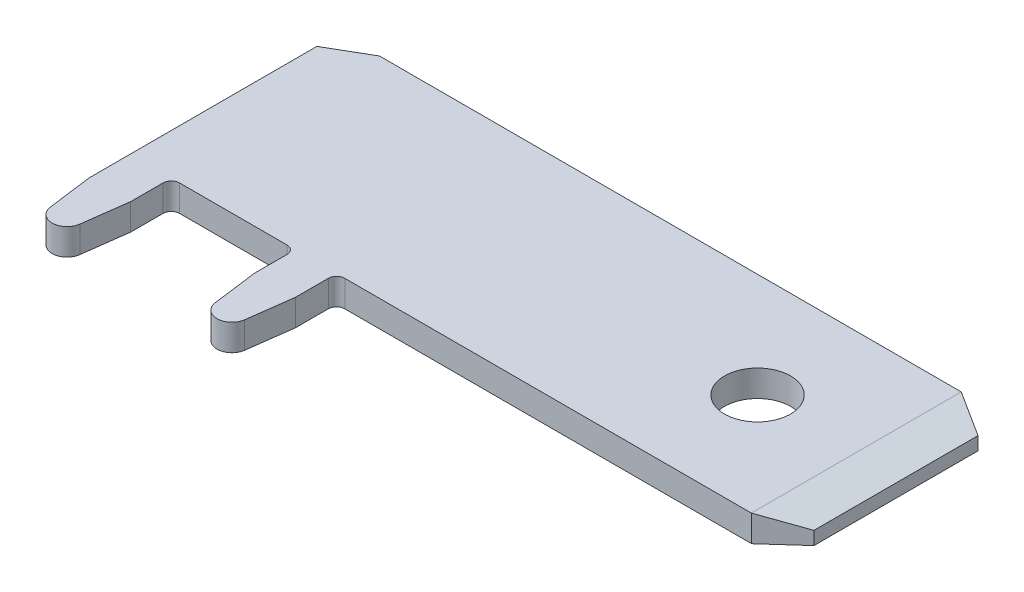
ISO-10303-21;
HEADER;
FILE_DESCRIPTION(('STEP AP214'),'2;1');
FILE_NAME('part.step','',(''),(''),'','','');
FILE_SCHEMA(('AUTOMOTIVE_DESIGN { 1 0 10303 214 1 1 1 1 }'));
ENDSEC;
DATA;
#1=APPLICATION_CONTEXT('core data for automotive mechanical design processes');
#2=APPLICATION_PROTOCOL_DEFINITION('international standard','automotive_design',2000,#1);
#3=PRODUCT_CONTEXT('',#1,'mechanical');
#4=PRODUCT('Part','Part','',(#3));
#5=PRODUCT_RELATED_PRODUCT_CATEGORY('part','',(#4));
#6=PRODUCT_DEFINITION_FORMATION('','',#4);
#7=PRODUCT_DEFINITION_CONTEXT('part definition',#1,'design');
#8=PRODUCT_DEFINITION('design','',#6,#7);
#9=PRODUCT_DEFINITION_SHAPE('','',#8);
#10=(LENGTH_UNIT() NAMED_UNIT(*) SI_UNIT(.MILLI.,.METRE.));
#11=(NAMED_UNIT(*) PLANE_ANGLE_UNIT() SI_UNIT($,.RADIAN.));
#12=(NAMED_UNIT(*) SI_UNIT($,.STERADIAN.) SOLID_ANGLE_UNIT());
#13=UNCERTAINTY_MEASURE_WITH_UNIT(LENGTH_MEASURE(1.E-05),#10,'distance_accuracy_value','');
#14=(GEOMETRIC_REPRESENTATION_CONTEXT(3) GLOBAL_UNCERTAINTY_ASSIGNED_CONTEXT((#13)) GLOBAL_UNIT_ASSIGNED_CONTEXT((#10,
#11,#12)) REPRESENTATION_CONTEXT('',''));
#15=CARTESIAN_POINT('',(0.,0.,0.));
#16=DIRECTION('',(0.,0.,1.));
#17=DIRECTION('',(1.,0.,0.));
#18=AXIS2_PLACEMENT_3D('',#15,#16,#17);
#19=CARTESIAN_POINT('',(19.99062151867,0.2,-6.35));
#20=DIRECTION('',(-0.164398987305406,-0.986393923832136,0.));
#21=DIRECTION('',(0.986393923832136,-0.164398987305406,0.));
#22=AXIS2_PLACEMENT_3D('',#19,#20,#21);
#23=PLANE('',#22);
#24=DIRECTION('',(-0.857142857142847,0.142857142857145,0.49487165930541));
#25=VECTOR('',#24,1.);
#26=CARTESIAN_POINT('',(19.99062151867,0.2,-0.692820323027562));
#27=LINE('',#26,#25);
#28=CARTESIAN_POINT('',(19.99062151867,0.2,-0.692820323027541));
#29=VERTEX_POINT('',#28);
#30=CARTESIAN_POINT('',(18.79062151867,0.4,0.));
#31=VERTEX_POINT('',#30);
#32=EDGE_CURVE('E202',#29,#31,#27,.T.);
#33=ORIENTED_EDGE('',*,*,#32,.F.);
#34=DIRECTION('',(0.,0.,-1.));
#35=VECTOR('',#34,1.);
#36=CARTESIAN_POINT('',(19.99062151867,0.2,-0.6928203230275));
#37=LINE('',#36,#35);
#38=CARTESIAN_POINT('',(19.99062151867,0.2,-5.657179676972));
#39=VERTEX_POINT('',#38);
#40=EDGE_CURVE('E274',#39,#29,#37,.F.);
#41=ORIENTED_EDGE('',*,*,#40,.F.);
#42=DIRECTION('',(0.85714285714285,-0.14285714285712,0.494871659305411));
#43=VECTOR('',#42,1.);
#44=CARTESIAN_POINT('',(18.7906215186698,0.4,-6.34999999999969));
#45=LINE('',#44,#43);
#46=CARTESIAN_POINT('',(18.79062151867,0.4,-6.34999999999992));
#47=VERTEX_POINT('',#46);
#48=EDGE_CURVE('E267',#47,#39,#45,.T.);
#49=ORIENTED_EDGE('',*,*,#48,.F.);
#50=DIRECTION('',(0.,0.,1.));
#51=VECTOR('',#50,1.);
#52=CARTESIAN_POINT('',(18.79062151867,0.4,0.));
#53=LINE('',#52,#51);
#54=EDGE_CURVE('E172',#31,#47,#53,.F.);
#55=ORIENTED_EDGE('',*,*,#54,.F.);
#56=EDGE_LOOP('',(#33,#41,#49,#55));
#57=FACE_BOUND('',#56,.T.);
#58=ADVANCED_FACE('F16',(#57),#23,.F.);
#59=CARTESIAN_POINT('',(19.99062151867,-0.4,-0.6928203230275));
#60=DIRECTION('',(1.,0.,0.));
#61=DIRECTION('',(0.,0.,-1.));
#62=AXIS2_PLACEMENT_3D('',#59,#60,#61);
#63=PLANE('',#62);
#64=DIRECTION('',(0.,1.,0.));
#65=VECTOR('',#64,1.);
#66=CARTESIAN_POINT('',(19.99062151867,-0.4,-0.692820323027562));
#67=LINE('',#66,#65);
#68=CARTESIAN_POINT('',(19.99062151867,-0.200000000000342,-0.69282032302753));
#69=VERTEX_POINT('',#68);
#70=EDGE_CURVE('E206',#69,#29,#67,.T.);
#71=ORIENTED_EDGE('',*,*,#70,.F.);
#72=DIRECTION('',(0.,0.,1.));
#73=VECTOR('',#72,1.);
#74=CARTESIAN_POINT('',(19.9906215186701,-0.200000000000547,-6.35));
#75=LINE('',#74,#73);
#76=CARTESIAN_POINT('',(19.99062151867,-0.200000000000137,-5.657179676972));
#77=VERTEX_POINT('',#76);
#78=EDGE_CURVE('E279',#69,#77,#75,.F.);
#79=ORIENTED_EDGE('',*,*,#78,.T.);
#80=DIRECTION('',(0.,1.,0.));
#81=VECTOR('',#80,1.);
#82=CARTESIAN_POINT('',(19.99062151867,-0.4,-5.657179676972));
#83=LINE('',#82,#81);
#84=EDGE_CURVE('E269',#39,#77,#83,.F.);
#85=ORIENTED_EDGE('',*,*,#84,.F.);
#86=ORIENTED_EDGE('',*,*,#40,.T.);
#87=EDGE_LOOP('',(#71,#79,#85,#86));
#88=FACE_BOUND('',#87,.T.);
#89=ADVANCED_FACE('F392',(#88),#63,.T.);
#90=CARTESIAN_POINT('',(19.99062151867,-0.4,-5.657179676972));
#91=DIRECTION('',(0.500000000000017,0.,-0.866025403784429));
#92=DIRECTION('',(-0.866025403784429,0.,-0.500000000000017));
#93=AXIS2_PLACEMENT_3D('',#90,#91,#92);
#94=PLANE('',#93);
#95=ORIENTED_EDGE('',*,*,#84,.T.);
#96=DIRECTION('',(-0.856848278928121,-0.145194246428069,-0.49470158449524));
#97=VECTOR('',#96,1.);
#98=CARTESIAN_POINT('',(19.9906215186701,-0.200000000000547,-5.657179676972));
#99=LINE('',#98,#97);
#100=CARTESIAN_POINT('',(18.8103429607996,-0.4,-6.33861382007789));
#101=VERTEX_POINT('',#100);
#102=EDGE_CURVE('E198',#77,#101,#99,.T.);
#103=ORIENTED_EDGE('',*,*,#102,.T.);
#104=DIRECTION('',(-0.866025403784429,0.,-0.500000000000017));
#105=VECTOR('',#104,1.);
#106=CARTESIAN_POINT('',(19.99062151867,-0.4,-5.657179676972));
#107=LINE('',#106,#105);
#108=CARTESIAN_POINT('',(18.7906215186699,-0.4,-6.34999999999989));
#109=VERTEX_POINT('',#108);
#110=EDGE_CURVE('E270',#101,#109,#107,.T.);
#111=ORIENTED_EDGE('',*,*,#110,.T.);
#112=DIRECTION('',(0.,1.,0.));
#113=VECTOR('',#112,1.);
#114=CARTESIAN_POINT('',(18.79062151867,-0.4,-6.35));
#115=LINE('',#114,#113);
#116=EDGE_CURVE('E177',#47,#109,#115,.F.);
#117=ORIENTED_EDGE('',*,*,#116,.F.);
#118=ORIENTED_EDGE('',*,*,#48,.T.);
#119=EDGE_LOOP('',(#95,#103,#111,#117,#118));
#120=FACE_BOUND('',#119,.T.);
#121=ADVANCED_FACE('F385',(#120),#94,.T.);
#122=CARTESIAN_POINT('',(18.79062151867,-0.4,0.));
#123=DIRECTION('',(0.500000000000017,0.,0.866025403784429));
#124=DIRECTION('',(0.866025403784429,0.,-0.500000000000017));
#125=AXIS2_PLACEMENT_3D('',#122,#123,#124);
#126=PLANE('',#125);
#127=DIRECTION('',(0.866025403784429,0.,-0.500000000000017));
#128=VECTOR('',#127,1.);
#129=CARTESIAN_POINT('',(18.79062151867,-0.4,0.));
#130=LINE('',#129,#128);
#131=CARTESIAN_POINT('',(18.79062151867,-0.4,0.));
#132=VERTEX_POINT('',#131);
#133=CARTESIAN_POINT('',(18.8103429607992,-0.4,-0.0113861799221007));
#134=VERTEX_POINT('',#133);
#135=EDGE_CURVE('E34',#132,#134,#130,.T.);
#136=ORIENTED_EDGE('',*,*,#135,.T.);
#137=DIRECTION('',(0.856848278928186,0.14519424642808,-0.494701584495125));
#138=VECTOR('',#137,1.);
#139=CARTESIAN_POINT('',(18.8103429608,-0.4,-0.0113861799207098));
#140=LINE('',#139,#138);
#141=EDGE_CURVE('E216',#134,#69,#140,.T.);
#142=ORIENTED_EDGE('',*,*,#141,.T.);
#143=ORIENTED_EDGE('',*,*,#70,.T.);
#144=ORIENTED_EDGE('',*,*,#32,.T.);
#145=DIRECTION('',(0.,1.,0.));
#146=VECTOR('',#145,1.);
#147=CARTESIAN_POINT('',(18.79062151867,-0.4,0.));
#148=LINE('',#147,#146);
#149=EDGE_CURVE('E331',#132,#31,#148,.T.);
#150=ORIENTED_EDGE('',*,*,#149,.F.);
#151=EDGE_LOOP('',(#136,#142,#143,#144,#150));
#152=FACE_BOUND('',#151,.T.);
#153=ADVANCED_FACE('F395',(#152),#126,.T.);
#154=CARTESIAN_POINT('',(0.,0.4,0.));
#155=DIRECTION('',(0.,1.,0.));
#156=DIRECTION('',(0.,0.,1.));
#157=AXIS2_PLACEMENT_3D('',#154,#155,#156);
#158=PLANE('',#157);
#159=CARTESIAN_POINT('',(15.79062151867,0.4,-3.1875));
#160=DIRECTION('',(0.,-1.,0.));
#161=DIRECTION('',(0.,0.,-1.));
#162=AXIS2_PLACEMENT_3D('',#159,#160,#161);
#163=CIRCLE('',#162,1.);
#164=CARTESIAN_POINT('',(15.79062151867,0.4,-4.1875));
#165=VERTEX_POINT('',#164);
#166=EDGE_CURVE('E284',#165,#165,#163,.T.);
#167=ORIENTED_EDGE('',*,*,#166,.T.);
#168=EDGE_LOOP('',(#167));
#169=FACE_BOUND('',#168,.T.);
#170=DIRECTION('',(1.,0.,0.));
#171=VECTOR('',#170,1.);
#172=CARTESIAN_POINT('',(6.490684076923,0.4,0.));
#173=LINE('',#172,#171);
#174=CARTESIAN_POINT('',(6.490684076923,0.4,0.));
#175=VERTEX_POINT('',#174);
#176=EDGE_CURVE('E209',#31,#175,#173,.F.);
#177=ORIENTED_EDGE('',*,*,#176,.F.);
#178=ORIENTED_EDGE('',*,*,#54,.T.);
#179=DIRECTION('',(-1.,0.,0.));
#180=VECTOR('',#179,1.);
#181=CARTESIAN_POINT('',(18.79062151867,0.4,-6.35));
#182=LINE('',#181,#180);
#183=CARTESIAN_POINT('',(1.190621518674,0.4,-6.35));
#184=VERTEX_POINT('',#183);
#185=EDGE_CURVE('E166',#184,#47,#182,.F.);
#186=ORIENTED_EDGE('',*,*,#185,.F.);
#187=DIRECTION('',(-0.865238937528222,0.,0.501359732113613));
#188=VECTOR('',#187,1.);
#189=CARTESIAN_POINT('',(1.190621518674,0.4,-6.35));
#190=LINE('',#189,#188);
#191=CARTESIAN_POINT('',(-0.00937848132603277,0.4,-5.65466411942207));
#192=VERTEX_POINT('',#191);
#193=EDGE_CURVE('E156',#192,#184,#190,.F.);
#194=ORIENTED_EDGE('',*,*,#193,.F.);
#195=DIRECTION('',(0.,0.,1.));
#196=VECTOR('',#195,1.);
#197=CARTESIAN_POINT('',(-0.009378481325995,0.4,-5.654664119422));
#198=LINE('',#197,#196);
#199=CARTESIAN_POINT('',(-0.009378481325995,0.400000000000001,1.23));
#200=VERTEX_POINT('',#199);
#201=EDGE_CURVE('E183',#200,#192,#198,.F.);
#202=ORIENTED_EDGE('',*,*,#201,.F.);
#203=DIRECTION('',(0.130526192220101,0.,0.991444861373804));
#204=VECTOR('',#203,1.);
#205=CARTESIAN_POINT('',(-0.009378481325995,0.4,1.23));
#206=LINE('',#205,#204);
#207=CARTESIAN_POINT('',(0.169502610180513,0.4,2.58873678649902));
#208=VERTEX_POINT('',#207);
#209=EDGE_CURVE('E143',#208,#200,#206,.F.);
#210=ORIENTED_EDGE('',*,*,#209,.F.);
#211=CARTESIAN_POINT('',(0.6156527977987,0.4,2.53));
#212=DIRECTION('',(0.,1.,0.));
#213=DIRECTION('',(0.,0.,1.));
#214=AXIS2_PLACEMENT_3D('',#211,#212,#213);
#215=CIRCLE('',#214,0.45);
#216=CARTESIAN_POINT('',(1.061802985417,0.4,2.58873678649903));
#217=VERTEX_POINT('',#216);
#218=EDGE_CURVE('E19',#217,#208,#215,.F.);
#219=ORIENTED_EDGE('',*,*,#218,.F.);
#220=DIRECTION('',(0.130526192220101,0.,-0.991444861373804));
#221=VECTOR('',#220,1.);
#222=CARTESIAN_POINT('',(1.061802985417,0.4,2.588736786499));
#223=LINE('',#222,#221);
#224=CARTESIAN_POINT('',(1.24068407692317,0.4,1.23000000000002));
#225=VERTEX_POINT('',#224);
#226=EDGE_CURVE('E128',#225,#217,#223,.F.);
#227=ORIENTED_EDGE('',*,*,#226,.F.);
#228=DIRECTION('',(0.000352217394440883,0.,-0.999999937971452));
#229=VECTOR('',#228,1.);
#230=CARTESIAN_POINT('',(1.240684076923,0.4,1.23));
#231=LINE('',#230,#229);
#232=CARTESIAN_POINT('',(1.24102928100519,0.4,0.249911945651395));
#233=VERTEX_POINT('',#232);
#234=EDGE_CURVE('E247',#233,#225,#231,.F.);
#235=ORIENTED_EDGE('',*,*,#234,.F.);
#236=CARTESIAN_POINT('',(1.491029265498,0.4,0.25));
#237=DIRECTION('',(0.,1.,0.));
#238=DIRECTION('',(0.,0.,1.));
#239=AXIS2_PLACEMENT_3D('',#236,#237,#238);
#240=CIRCLE('',#239,0.25);
#241=CARTESIAN_POINT('',(1.491029265498,0.4,0.));
#242=VERTEX_POINT('',#241);
#243=EDGE_CURVE('E246',#233,#242,#240,.F.);
#244=ORIENTED_EDGE('',*,*,#243,.T.);
#245=DIRECTION('',(1.,0.,0.));
#246=VECTOR('',#245,1.);
#247=CARTESIAN_POINT('',(1.491029265498,0.4,0.));
#248=LINE('',#247,#246);
#249=CARTESIAN_POINT('',(4.740621518674,0.4,0.));
#250=VERTEX_POINT('',#249);
#251=EDGE_CURVE('E243',#250,#242,#248,.F.);
#252=ORIENTED_EDGE('',*,*,#251,.F.);
#253=CARTESIAN_POINT('',(4.740621518674,0.4,0.25));
#254=DIRECTION('',(0.,1.,0.));
#255=DIRECTION('',(0.,0.,1.));
#256=AXIS2_PLACEMENT_3D('',#253,#254,#255);
#257=CIRCLE('',#256,0.25);
#258=CARTESIAN_POINT('',(4.990621518674,0.4,0.25));
#259=VERTEX_POINT('',#258);
#260=EDGE_CURVE('E240',#250,#259,#257,.F.);
#261=ORIENTED_EDGE('',*,*,#260,.T.);
#262=DIRECTION('',(0.,0.,1.));
#263=VECTOR('',#262,1.);
#264=CARTESIAN_POINT('',(4.990621518674,0.4,0.25));
#265=LINE('',#264,#263);
#266=CARTESIAN_POINT('',(4.990621518674,0.400000000000001,1.24));
#267=VERTEX_POINT('',#266);
#268=EDGE_CURVE('E238',#267,#259,#265,.F.);
#269=ORIENTED_EDGE('',*,*,#268,.F.);
#270=DIRECTION('',(0.130526192220101,0.,0.991444861373804));
#271=VECTOR('',#270,1.);
#272=CARTESIAN_POINT('',(4.990621518674,0.4,1.24));
#273=LINE('',#272,#271);
#274=CARTESIAN_POINT('',(5.16950261018066,0.4,2.59873678649899));
#275=VERTEX_POINT('',#274);
#276=EDGE_CURVE('E231',#275,#267,#273,.F.);
#277=ORIENTED_EDGE('',*,*,#276,.F.);
#278=CARTESIAN_POINT('',(5.615652797799,0.4,2.54));
#279=DIRECTION('',(0.,1.,0.));
#280=DIRECTION('',(0.,0.,1.));
#281=AXIS2_PLACEMENT_3D('',#278,#279,#280);
#282=CIRCLE('',#281,0.45);
#283=CARTESIAN_POINT('',(6.061802985417,0.4,2.59873678649901));
#284=VERTEX_POINT('',#283);
#285=EDGE_CURVE('E335',#284,#275,#282,.F.);
#286=ORIENTED_EDGE('',*,*,#285,.F.);
#287=DIRECTION('',(0.130526192220101,0.,-0.991444861373804));
#288=VECTOR('',#287,1.);
#289=CARTESIAN_POINT('',(6.061802985417,0.4,2.598736786499));
#290=LINE('',#289,#288);
#291=CARTESIAN_POINT('',(6.24068407692318,0.4,1.24000000000002));
#292=VERTEX_POINT('',#291);
#293=EDGE_CURVE('E226',#292,#284,#290,.F.);
#294=ORIENTED_EDGE('',*,*,#293,.F.);
#295=DIRECTION('',(0.,0.,-1.));
#296=VECTOR('',#295,1.);
#297=CARTESIAN_POINT('',(6.240684076923,0.4,1.24));
#298=LINE('',#297,#296);
#299=CARTESIAN_POINT('',(6.240684076923,0.4,0.25));
#300=VERTEX_POINT('',#299);
#301=EDGE_CURVE('E219',#300,#292,#298,.F.);
#302=ORIENTED_EDGE('',*,*,#301,.F.);
#303=CARTESIAN_POINT('',(6.490684076923,0.4,0.25));
#304=DIRECTION('',(0.,1.,0.));
#305=DIRECTION('',(0.,0.,1.));
#306=AXIS2_PLACEMENT_3D('',#303,#304,#305);
#307=CIRCLE('',#306,0.25);
#308=EDGE_CURVE('E212',#300,#175,#307,.F.);
#309=ORIENTED_EDGE('',*,*,#308,.T.);
#310=EDGE_LOOP('',(#177,#178,#186,#194,#202,#210,#219,#227,#235,#244,#252,#261,#269,#277,#286,
#294,#302,#309));
#311=FACE_BOUND('',#310,.T.);
#312=ADVANCED_FACE('F170',(#169,#311),#158,.T.);
#313=CARTESIAN_POINT('',(18.8103429608,-0.4,-6.35));
#314=DIRECTION('',(-0.167069891815996,0.985945054883177,0.));
#315=DIRECTION('',(-0.985945054883177,-0.167069891815996,0.));
#316=AXIS2_PLACEMENT_3D('',#313,#314,#315);
#317=PLANE('',#316);
#318=ORIENTED_EDGE('',*,*,#102,.F.);
#319=ORIENTED_EDGE('',*,*,#78,.F.);
#320=ORIENTED_EDGE('',*,*,#141,.F.);
#321=DIRECTION('',(0.,0.,1.));
#322=VECTOR('',#321,1.);
#323=CARTESIAN_POINT('',(18.8103429608,-0.4,0.));
#324=LINE('',#323,#322);
#325=EDGE_CURVE('E194',#134,#101,#324,.F.);
#326=ORIENTED_EDGE('',*,*,#325,.T.);
#327=EDGE_LOOP('',(#318,#319,#320,#326));
#328=FACE_BOUND('',#327,.T.);
#329=ADVANCED_FACE('F390',(#328),#317,.F.);
#330=CARTESIAN_POINT('',(18.79062151867,-0.4,-6.35));
#331=DIRECTION('',(0.,0.,-1.));
#332=DIRECTION('',(-1.,0.,0.));
#333=AXIS2_PLACEMENT_3D('',#330,#331,#332);
#334=PLANE('',#333);
#335=DIRECTION('',(0.,1.,0.));
#336=VECTOR('',#335,1.);
#337=CARTESIAN_POINT('',(1.190621518674,-0.4,-6.35));
#338=LINE('',#337,#336);
#339=CARTESIAN_POINT('',(1.190621518674,-0.4,-6.35));
#340=VERTEX_POINT('',#339);
#341=EDGE_CURVE('E161',#184,#340,#338,.F.);
#342=ORIENTED_EDGE('',*,*,#341,.F.);
#343=ORIENTED_EDGE('',*,*,#185,.T.);
#344=ORIENTED_EDGE('',*,*,#116,.T.);
#345=DIRECTION('',(1.,0.,0.));
#346=VECTOR('',#345,1.);
#347=CARTESIAN_POINT('',(0.,-0.4,-6.35));
#348=LINE('',#347,#346);
#349=EDGE_CURVE('E182',#109,#340,#348,.F.);
#350=ORIENTED_EDGE('',*,*,#349,.T.);
#351=EDGE_LOOP('',(#342,#343,#344,#350));
#352=FACE_BOUND('',#351,.T.);
#353=ADVANCED_FACE('F180',(#352),#334,.T.);
#354=CARTESIAN_POINT('',(1.190621518674,-0.4,-6.35));
#355=DIRECTION('',(-0.501359732113613,0.,-0.865238937528222));
#356=DIRECTION('',(-0.865238937528222,0.,0.501359732113613));
#357=AXIS2_PLACEMENT_3D('',#354,#355,#356);
#358=PLANE('',#357);
#359=ORIENTED_EDGE('',*,*,#341,.T.);
#360=DIRECTION('',(-0.86523893752814,0.,0.501359732113754));
#361=VECTOR('',#360,1.);
#362=CARTESIAN_POINT('',(1.190621518674,-0.4,-6.35));
#363=LINE('',#362,#361);
#364=CARTESIAN_POINT('',(-0.00937848132599496,-0.4,-5.654664119422));
#365=VERTEX_POINT('',#364);
#366=EDGE_CURVE('E193',#340,#365,#363,.T.);
#367=ORIENTED_EDGE('',*,*,#366,.T.);
#368=DIRECTION('',(0.,1.,0.));
#369=VECTOR('',#368,1.);
#370=CARTESIAN_POINT('',(-0.009378481325995,-0.4,-5.654664119422));
#371=LINE('',#370,#369);
#372=EDGE_CURVE('E164',#192,#365,#371,.F.);
#373=ORIENTED_EDGE('',*,*,#372,.F.);
#374=ORIENTED_EDGE('',*,*,#193,.T.);
#375=EDGE_LOOP('',(#359,#367,#373,#374));
#376=FACE_BOUND('',#375,.T.);
#377=ADVANCED_FACE('F158',(#376),#358,.T.);
#378=CARTESIAN_POINT('',(-0.009378481325995,-0.4,-5.654664119422));
#379=DIRECTION('',(-1.,0.,0.));
#380=DIRECTION('',(0.,0.,1.));
#381=AXIS2_PLACEMENT_3D('',#378,#379,#380);
#382=PLANE('',#381);
#383=ORIENTED_EDGE('',*,*,#372,.T.);
#384=DIRECTION('',(0.,0.,1.));
#385=VECTOR('',#384,1.);
#386=CARTESIAN_POINT('',(-0.009378481325995,-0.4,0.));
#387=LINE('',#386,#385);
#388=CARTESIAN_POINT('',(-0.00937848132599492,-0.4,1.23));
#389=VERTEX_POINT('',#388);
#390=EDGE_CURVE('E359',#365,#389,#387,.T.);
#391=ORIENTED_EDGE('',*,*,#390,.T.);
#392=DIRECTION('',(0.,1.,0.));
#393=VECTOR('',#392,1.);
#394=CARTESIAN_POINT('',(-0.009378481325995,-0.4,1.23));
#395=LINE('',#394,#393);
#396=EDGE_CURVE('E258',#200,#389,#395,.F.);
#397=ORIENTED_EDGE('',*,*,#396,.F.);
#398=ORIENTED_EDGE('',*,*,#201,.T.);
#399=EDGE_LOOP('',(#383,#391,#397,#398));
#400=FACE_BOUND('',#399,.T.);
#401=ADVANCED_FACE('F373',(#400),#382,.T.);
#402=CARTESIAN_POINT('',(-0.009378481325995,-0.4,1.23));
#403=DIRECTION('',(-0.991444861373804,0.,0.130526192220101));
#404=DIRECTION('',(0.130526192220101,0.,0.991444861373804));
#405=AXIS2_PLACEMENT_3D('',#402,#403,#404);
#406=PLANE('',#405);
#407=ORIENTED_EDGE('',*,*,#396,.T.);
#408=DIRECTION('',(0.130526192220073,0.,0.991444861373808));
#409=VECTOR('',#408,1.);
#410=CARTESIAN_POINT('',(-0.009378481325995,-0.4,1.23));
#411=LINE('',#410,#409);
#412=CARTESIAN_POINT('',(0.169502610180493,-0.4,2.58873678649902));
#413=VERTEX_POINT('',#412);
#414=EDGE_CURVE('E328',#389,#413,#411,.T.);
#415=ORIENTED_EDGE('',*,*,#414,.T.);
#416=DIRECTION('',(0.,1.,0.));
#417=VECTOR('',#416,1.);
#418=CARTESIAN_POINT('',(0.169502610180483,-0.4,2.588736786499));
#419=LINE('',#418,#417);
#420=EDGE_CURVE('E254',#208,#413,#419,.F.);
#421=ORIENTED_EDGE('',*,*,#420,.F.);
#422=ORIENTED_EDGE('',*,*,#209,.T.);
#423=EDGE_LOOP('',(#407,#415,#421,#422));
#424=FACE_BOUND('',#423,.T.);
#425=ADVANCED_FACE('F516',(#424),#406,.T.);
#426=CARTESIAN_POINT('',(0.6156527977987,-0.4,2.53));
#427=DIRECTION('',(0.,1.,0.));
#428=DIRECTION('',(0.,0.,1.));
#429=AXIS2_PLACEMENT_3D('',#426,#427,#428);
#430=CYLINDRICAL_SURFACE('',#429,0.45);
#431=ORIENTED_EDGE('',*,*,#420,.T.);
#432=CARTESIAN_POINT('',(0.6156527977987,-0.4,2.53));
#433=DIRECTION('',(0.,1.,0.));
#434=DIRECTION('',(0.,0.,1.));
#435=AXIS2_PLACEMENT_3D('',#432,#433,#434);
#436=CIRCLE('',#435,0.45);
#437=CARTESIAN_POINT('',(1.06180298541701,-0.4,2.58873678649894));
#438=VERTEX_POINT('',#437);
#439=EDGE_CURVE('E324',#413,#438,#436,.T.);
#440=ORIENTED_EDGE('',*,*,#439,.T.);
#441=DIRECTION('',(0.,1.,0.));
#442=VECTOR('',#441,1.);
#443=CARTESIAN_POINT('',(1.061802985417,-0.4,2.588736786499));
#444=LINE('',#443,#442);
#445=EDGE_CURVE('E250',#217,#438,#444,.F.);
#446=ORIENTED_EDGE('',*,*,#445,.F.);
#447=ORIENTED_EDGE('',*,*,#218,.T.);
#448=EDGE_LOOP('',(#431,#440,#446,#447));
#449=FACE_BOUND('',#448,.T.);
#450=ADVANCED_FACE('F517',(#449),#430,.T.);
#451=CARTESIAN_POINT('',(1.061802985417,-0.4,2.588736786499));
#452=DIRECTION('',(0.991444861373804,0.,0.130526192220101));
#453=DIRECTION('',(0.130526192220101,0.,-0.991444861373804));
#454=AXIS2_PLACEMENT_3D('',#451,#452,#453);
#455=PLANE('',#454);
#456=ORIENTED_EDGE('',*,*,#445,.T.);
#457=DIRECTION('',(0.130526192219718,0.,-0.991444861373854));
#458=VECTOR('',#457,1.);
#459=CARTESIAN_POINT('',(1.061802985417,-0.4,2.588736786499));
#460=LINE('',#459,#458);
#461=CARTESIAN_POINT('',(1.240684076923,-0.4,1.23000000000002));
#462=VERTEX_POINT('',#461);
#463=EDGE_CURVE('E327',#438,#462,#460,.T.);
#464=ORIENTED_EDGE('',*,*,#463,.T.);
#465=DIRECTION('',(0.,1.,0.));
#466=VECTOR('',#465,1.);
#467=CARTESIAN_POINT('',(1.240684076923,-0.4,1.23));
#468=LINE('',#467,#466);
#469=EDGE_CURVE('E249',#225,#462,#468,.F.);
#470=ORIENTED_EDGE('',*,*,#469,.F.);
#471=ORIENTED_EDGE('',*,*,#226,.T.);
#472=EDGE_LOOP('',(#456,#464,#470,#471));
#473=FACE_BOUND('',#472,.T.);
#474=ADVANCED_FACE('F447',(#473),#455,.T.);
#475=CARTESIAN_POINT('',(1.240684076923,-0.4,1.23));
#476=DIRECTION('',(0.999999937971452,0.,0.000352217394440883));
#477=DIRECTION('',(0.000352217394440883,0.,-0.999999937971452));
#478=AXIS2_PLACEMENT_3D('',#475,#476,#477);
#479=PLANE('',#478);
#480=ORIENTED_EDGE('',*,*,#469,.T.);
#481=DIRECTION('',(0.000352217395218529,0.,-0.999999937971451));
#482=VECTOR('',#481,1.);
#483=CARTESIAN_POINT('',(1.240684076923,-0.4,1.23));
#484=LINE('',#483,#482);
#485=CARTESIAN_POINT('',(1.24102928100557,-0.4,0.249911945651298));
#486=VERTEX_POINT('',#485);
#487=EDGE_CURVE('E323',#462,#486,#484,.T.);
#488=ORIENTED_EDGE('',*,*,#487,.T.);
#489=DIRECTION('',(0.,1.,0.));
#490=VECTOR('',#489,1.);
#491=CARTESIAN_POINT('',(1.24102928100514,-0.4,0.2499119456514));
#492=LINE('',#491,#490);
#493=EDGE_CURVE('E340',#486,#233,#492,.T.);
#494=ORIENTED_EDGE('',*,*,#493,.T.);
#495=ORIENTED_EDGE('',*,*,#234,.T.);
#496=EDGE_LOOP('',(#480,#488,#494,#495));
#497=FACE_BOUND('',#496,.T.);
#498=ADVANCED_FACE('F438',(#497),#479,.T.);
#499=CARTESIAN_POINT('',(1.491029265498,-0.4,0.25));
#500=DIRECTION('',(0.,1.,0.));
#501=DIRECTION('',(0.,0.,1.));
#502=AXIS2_PLACEMENT_3D('',#499,#500,#501);
#503=CYLINDRICAL_SURFACE('',#502,0.25);
#504=ORIENTED_EDGE('',*,*,#243,.F.);
#505=ORIENTED_EDGE('',*,*,#493,.F.);
#506=CARTESIAN_POINT('',(1.491029265498,-0.4,0.25));
#507=DIRECTION('',(0.,1.,0.));
#508=DIRECTION('',(0.,0.,1.));
#509=AXIS2_PLACEMENT_3D('',#506,#507,#508);
#510=CIRCLE('',#509,0.25);
#511=CARTESIAN_POINT('',(1.491029265498,-0.4,0.));
#512=VERTEX_POINT('',#511);
#513=EDGE_CURVE('E320',#486,#512,#510,.F.);
#514=ORIENTED_EDGE('',*,*,#513,.T.);
#515=DIRECTION('',(0.,1.,0.));
#516=VECTOR('',#515,1.);
#517=CARTESIAN_POINT('',(1.491029265498,-0.4,0.));
#518=LINE('',#517,#516);
#519=EDGE_CURVE('E245',#242,#512,#518,.F.);
#520=ORIENTED_EDGE('',*,*,#519,.F.);
#521=EDGE_LOOP('',(#504,#505,#514,#520));
#522=FACE_BOUND('',#521,.T.);
#523=ADVANCED_FACE('F436',(#522),#503,.F.);
#524=CARTESIAN_POINT('',(1.491029265498,-0.4,0.));
#525=DIRECTION('',(0.,0.,1.));
#526=DIRECTION('',(1.,0.,0.));
#527=AXIS2_PLACEMENT_3D('',#524,#525,#526);
#528=PLANE('',#527);
#529=ORIENTED_EDGE('',*,*,#519,.T.);
#530=DIRECTION('',(1.,0.,0.));
#531=VECTOR('',#530,1.);
#532=CARTESIAN_POINT('',(0.,-0.4,0.));
#533=LINE('',#532,#531);
#534=CARTESIAN_POINT('',(4.740621518674,-0.4,0.));
#535=VERTEX_POINT('',#534);
#536=EDGE_CURVE('E319',#512,#535,#533,.T.);
#537=ORIENTED_EDGE('',*,*,#536,.T.);
#538=DIRECTION('',(0.,1.,0.));
#539=VECTOR('',#538,1.);
#540=CARTESIAN_POINT('',(4.740621518674,-0.4,0.));
#541=LINE('',#540,#539);
#542=EDGE_CURVE('E338',#535,#250,#541,.T.);
#543=ORIENTED_EDGE('',*,*,#542,.T.);
#544=ORIENTED_EDGE('',*,*,#251,.T.);
#545=EDGE_LOOP('',(#529,#537,#543,#544));
#546=FACE_BOUND('',#545,.T.);
#547=ADVANCED_FACE('F429',(#546),#528,.T.);
#548=CARTESIAN_POINT('',(4.740621518674,-0.4,0.25));
#549=DIRECTION('',(0.,1.,0.));
#550=DIRECTION('',(0.,0.,1.));
#551=AXIS2_PLACEMENT_3D('',#548,#549,#550);
#552=CYLINDRICAL_SURFACE('',#551,0.25);
#553=ORIENTED_EDGE('',*,*,#260,.F.);
#554=ORIENTED_EDGE('',*,*,#542,.F.);
#555=CARTESIAN_POINT('',(4.740621518674,-0.4,0.25));
#556=DIRECTION('',(0.,1.,0.));
#557=DIRECTION('',(0.,0.,1.));
#558=AXIS2_PLACEMENT_3D('',#555,#556,#557);
#559=CIRCLE('',#558,0.25);
#560=CARTESIAN_POINT('',(4.990621518674,-0.4,0.25));
#561=VERTEX_POINT('',#560);
#562=EDGE_CURVE('E315',#535,#561,#559,.F.);
#563=ORIENTED_EDGE('',*,*,#562,.T.);
#564=DIRECTION('',(0.,1.,0.));
#565=VECTOR('',#564,1.);
#566=CARTESIAN_POINT('',(4.990621518674,-0.4,0.25));
#567=LINE('',#566,#565);
#568=EDGE_CURVE('E235',#259,#561,#567,.F.);
#569=ORIENTED_EDGE('',*,*,#568,.F.);
#570=EDGE_LOOP('',(#553,#554,#563,#569));
#571=FACE_BOUND('',#570,.T.);
#572=ADVANCED_FACE('F445',(#571),#552,.F.);
#573=CARTESIAN_POINT('',(4.990621518674,-0.4,0.25));
#574=DIRECTION('',(-1.,0.,0.));
#575=DIRECTION('',(0.,0.,1.));
#576=AXIS2_PLACEMENT_3D('',#573,#574,#575);
#577=PLANE('',#576);
#578=ORIENTED_EDGE('',*,*,#568,.T.);
#579=DIRECTION('',(0.,0.,1.));
#580=VECTOR('',#579,1.);
#581=CARTESIAN_POINT('',(4.990621518674,-0.4,0.));
#582=LINE('',#581,#580);
#583=CARTESIAN_POINT('',(4.990621518674,-0.4,1.24000000000002));
#584=VERTEX_POINT('',#583);
#585=EDGE_CURVE('E318',#561,#584,#582,.T.);
#586=ORIENTED_EDGE('',*,*,#585,.T.);
#587=DIRECTION('',(0.,1.,0.));
#588=VECTOR('',#587,1.);
#589=CARTESIAN_POINT('',(4.990621518674,-0.4,1.24));
#590=LINE('',#589,#588);
#591=EDGE_CURVE('E234',#267,#584,#590,.F.);
#592=ORIENTED_EDGE('',*,*,#591,.F.);
#593=ORIENTED_EDGE('',*,*,#268,.T.);
#594=EDGE_LOOP('',(#578,#586,#592,#593));
#595=FACE_BOUND('',#594,.T.);
#596=ADVANCED_FACE('F479',(#595),#577,.T.);
#597=CARTESIAN_POINT('',(4.990621518674,-0.4,1.24));
#598=DIRECTION('',(-0.991444861373804,0.,0.130526192220101));
#599=DIRECTION('',(0.130526192220101,0.,0.991444861373804));
#600=AXIS2_PLACEMENT_3D('',#597,#598,#599);
#601=PLANE('',#600);
#602=ORIENTED_EDGE('',*,*,#591,.T.);
#603=DIRECTION('',(0.130526192219718,0.,0.991444861373854));
#604=VECTOR('',#603,1.);
#605=CARTESIAN_POINT('',(4.990621518674,-0.4,1.24));
#606=LINE('',#605,#604);
#607=CARTESIAN_POINT('',(5.16950261018038,-0.4,2.59873678649894));
#608=VERTEX_POINT('',#607);
#609=EDGE_CURVE('E314',#584,#608,#606,.T.);
#610=ORIENTED_EDGE('',*,*,#609,.T.);
#611=DIRECTION('',(0.,1.,0.));
#612=VECTOR('',#611,1.);
#613=CARTESIAN_POINT('',(5.16950261018077,-0.4,2.5987367864989));
#614=LINE('',#613,#612);
#615=EDGE_CURVE('E228',#275,#608,#614,.F.);
#616=ORIENTED_EDGE('',*,*,#615,.F.);
#617=ORIENTED_EDGE('',*,*,#276,.T.);
#618=EDGE_LOOP('',(#602,#610,#616,#617));
#619=FACE_BOUND('',#618,.T.);
#620=ADVANCED_FACE('F475',(#619),#601,.T.);
#621=CARTESIAN_POINT('',(5.615652797799,-0.4,2.54));
#622=DIRECTION('',(0.,1.,0.));
#623=DIRECTION('',(0.,0.,1.));
#624=AXIS2_PLACEMENT_3D('',#621,#622,#623);
#625=CYLINDRICAL_SURFACE('',#624,0.45);
#626=ORIENTED_EDGE('',*,*,#615,.T.);
#627=CARTESIAN_POINT('',(5.615652797799,-0.4,2.54));
#628=DIRECTION('',(0.,1.,0.));
#629=DIRECTION('',(0.,0.,1.));
#630=AXIS2_PLACEMENT_3D('',#627,#628,#629);
#631=CIRCLE('',#630,0.45);
#632=CARTESIAN_POINT('',(6.06180298541701,-0.4,2.59873678649892));
#633=VERTEX_POINT('',#632);
#634=EDGE_CURVE('E310',#608,#633,#631,.T.);
#635=ORIENTED_EDGE('',*,*,#634,.T.);
#636=DIRECTION('',(0.,1.,0.));
#637=VECTOR('',#636,1.);
#638=CARTESIAN_POINT('',(6.061802985417,-0.4,2.598736786499));
#639=LINE('',#638,#637);
#640=EDGE_CURVE('E223',#284,#633,#639,.F.);
#641=ORIENTED_EDGE('',*,*,#640,.F.);
#642=ORIENTED_EDGE('',*,*,#285,.T.);
#643=EDGE_LOOP('',(#626,#635,#641,#642));
#644=FACE_BOUND('',#643,.T.);
#645=ADVANCED_FACE('F471',(#644),#625,.T.);
#646=CARTESIAN_POINT('',(6.061802985417,-0.4,2.598736786499));
#647=DIRECTION('',(0.991444861373804,0.,0.130526192220101));
#648=DIRECTION('',(0.130526192220101,0.,-0.991444861373804));
#649=AXIS2_PLACEMENT_3D('',#646,#647,#648);
#650=PLANE('',#649);
#651=ORIENTED_EDGE('',*,*,#640,.T.);
#652=DIRECTION('',(0.130526192219719,0.,-0.991444861373854));
#653=VECTOR('',#652,1.);
#654=CARTESIAN_POINT('',(6.061802985417,-0.4,2.598736786499));
#655=LINE('',#654,#653);
#656=CARTESIAN_POINT('',(6.240684076923,-0.4,1.24));
#657=VERTEX_POINT('',#656);
#658=EDGE_CURVE('E313',#633,#657,#655,.T.);
#659=ORIENTED_EDGE('',*,*,#658,.T.);
#660=DIRECTION('',(0.,1.,0.));
#661=VECTOR('',#660,1.);
#662=CARTESIAN_POINT('',(6.240684076923,-0.4,1.24));
#663=LINE('',#662,#661);
#664=EDGE_CURVE('E222',#292,#657,#663,.F.);
#665=ORIENTED_EDGE('',*,*,#664,.F.);
#666=ORIENTED_EDGE('',*,*,#293,.T.);
#667=EDGE_LOOP('',(#651,#659,#665,#666));
#668=FACE_BOUND('',#667,.T.);
#669=ADVANCED_FACE('F467',(#668),#650,.T.);
#670=CARTESIAN_POINT('',(6.240684076923,-0.4,1.24));
#671=DIRECTION('',(1.,0.,0.));
#672=DIRECTION('',(0.,0.,-1.));
#673=AXIS2_PLACEMENT_3D('',#670,#671,#672);
#674=PLANE('',#673);
#675=ORIENTED_EDGE('',*,*,#664,.T.);
#676=DIRECTION('',(0.,0.,1.));
#677=VECTOR('',#676,1.);
#678=CARTESIAN_POINT('',(6.240684076923,-0.4,0.));
#679=LINE('',#678,#677);
#680=CARTESIAN_POINT('',(6.240684076923,-0.4,0.25));
#681=VERTEX_POINT('',#680);
#682=EDGE_CURVE('E309',#657,#681,#679,.F.);
#683=ORIENTED_EDGE('',*,*,#682,.T.);
#684=DIRECTION('',(0.,1.,0.));
#685=VECTOR('',#684,1.);
#686=CARTESIAN_POINT('',(6.240684076923,-0.4,0.25));
#687=LINE('',#686,#685);
#688=EDGE_CURVE('E334',#681,#300,#687,.T.);
#689=ORIENTED_EDGE('',*,*,#688,.T.);
#690=ORIENTED_EDGE('',*,*,#301,.T.);
#691=EDGE_LOOP('',(#675,#683,#689,#690));
#692=FACE_BOUND('',#691,.T.);
#693=ADVANCED_FACE('F464',(#692),#674,.T.);
#694=CARTESIAN_POINT('',(6.490684076923,-0.4,0.25));
#695=DIRECTION('',(0.,1.,0.));
#696=DIRECTION('',(0.,0.,1.));
#697=AXIS2_PLACEMENT_3D('',#694,#695,#696);
#698=CYLINDRICAL_SURFACE('',#697,0.25);
#699=ORIENTED_EDGE('',*,*,#308,.F.);
#700=ORIENTED_EDGE('',*,*,#688,.F.);
#701=CARTESIAN_POINT('',(6.490684076923,-0.4,0.25));
#702=DIRECTION('',(0.,1.,0.));
#703=DIRECTION('',(0.,0.,1.));
#704=AXIS2_PLACEMENT_3D('',#701,#702,#703);
#705=CIRCLE('',#704,0.25);
#706=CARTESIAN_POINT('',(6.490684076923,-0.4,0.));
#707=VERTEX_POINT('',#706);
#708=EDGE_CURVE('E306',#681,#707,#705,.F.);
#709=ORIENTED_EDGE('',*,*,#708,.T.);
#710=DIRECTION('',(0.,1.,0.));
#711=VECTOR('',#710,1.);
#712=CARTESIAN_POINT('',(6.490684076923,-0.4,0.));
#713=LINE('',#712,#711);
#714=EDGE_CURVE('E211',#175,#707,#713,.F.);
#715=ORIENTED_EDGE('',*,*,#714,.F.);
#716=EDGE_LOOP('',(#699,#700,#709,#715));
#717=FACE_BOUND('',#716,.T.);
#718=ADVANCED_FACE('F407',(#717),#698,.F.);
#719=CARTESIAN_POINT('',(6.490684076923,-0.4,0.));
#720=DIRECTION('',(0.,0.,1.));
#721=DIRECTION('',(1.,0.,0.));
#722=AXIS2_PLACEMENT_3D('',#719,#720,#721);
#723=PLANE('',#722);
#724=DIRECTION('',(1.,0.,0.));
#725=VECTOR('',#724,1.);
#726=CARTESIAN_POINT('',(0.,-0.4,0.));
#727=LINE('',#726,#725);
#728=EDGE_CURVE('E25',#707,#132,#727,.T.);
#729=ORIENTED_EDGE('',*,*,#728,.T.);
#730=ORIENTED_EDGE('',*,*,#149,.T.);
#731=ORIENTED_EDGE('',*,*,#176,.T.);
#732=ORIENTED_EDGE('',*,*,#714,.T.);
#733=EDGE_LOOP('',(#729,#730,#731,#732));
#734=FACE_BOUND('',#733,.T.);
#735=ADVANCED_FACE('F400',(#734),#723,.T.);
#736=CARTESIAN_POINT('',(15.79062151867,0.4,-3.1875));
#737=DIRECTION('',(0.,-1.,0.));
#738=DIRECTION('',(0.,0.,-1.));
#739=AXIS2_PLACEMENT_3D('',#736,#737,#738);
#740=CYLINDRICAL_SURFACE('',#739,1.);
#741=ORIENTED_EDGE('',*,*,#166,.F.);
#742=EDGE_LOOP('',(#741));
#743=FACE_BOUND('',#742,.T.);
#744=CARTESIAN_POINT('',(15.79062151867,-0.4,-3.1875));
#745=DIRECTION('',(0.,-1.,0.));
#746=DIRECTION('',(0.,0.,-1.));
#747=AXIS2_PLACEMENT_3D('',#744,#745,#746);
#748=CIRCLE('',#747,1.);
#749=CARTESIAN_POINT('',(15.79062151867,-0.4,-4.1875));
#750=VERTEX_POINT('',#749);
#751=EDGE_CURVE('E10',#750,#750,#748,.T.);
#752=ORIENTED_EDGE('',*,*,#751,.T.);
#753=EDGE_LOOP('',(#752));
#754=FACE_BOUND('',#753,.T.);
#755=ADVANCED_FACE('F450',(#743,#754),#740,.F.);
#756=CARTESIAN_POINT('',(0.,-0.4,0.));
#757=DIRECTION('',(0.,1.,0.));
#758=DIRECTION('',(0.,0.,1.));
#759=AXIS2_PLACEMENT_3D('',#756,#757,#758);
#760=PLANE('',#759);
#761=ORIENTED_EDGE('',*,*,#751,.F.);
#762=EDGE_LOOP('',(#761));
#763=FACE_BOUND('',#762,.T.);
#764=ORIENTED_EDGE('',*,*,#728,.F.);
#765=ORIENTED_EDGE('',*,*,#708,.F.);
#766=ORIENTED_EDGE('',*,*,#682,.F.);
#767=ORIENTED_EDGE('',*,*,#658,.F.);
#768=ORIENTED_EDGE('',*,*,#634,.F.);
#769=ORIENTED_EDGE('',*,*,#609,.F.);
#770=ORIENTED_EDGE('',*,*,#585,.F.);
#771=ORIENTED_EDGE('',*,*,#562,.F.);
#772=ORIENTED_EDGE('',*,*,#536,.F.);
#773=ORIENTED_EDGE('',*,*,#513,.F.);
#774=ORIENTED_EDGE('',*,*,#487,.F.);
#775=ORIENTED_EDGE('',*,*,#463,.F.);
#776=ORIENTED_EDGE('',*,*,#439,.F.);
#777=ORIENTED_EDGE('',*,*,#414,.F.);
#778=ORIENTED_EDGE('',*,*,#390,.F.);
#779=ORIENTED_EDGE('',*,*,#366,.F.);
#780=ORIENTED_EDGE('',*,*,#349,.F.);
#781=ORIENTED_EDGE('',*,*,#110,.F.);
#782=ORIENTED_EDGE('',*,*,#325,.F.);
#783=ORIENTED_EDGE('',*,*,#135,.F.);
#784=EDGE_LOOP('',(#764,#765,#766,#767,#768,#769,#770,#771,#772,#773,#774,#775,#776,#777,#778,
#779,#780,#781,#782,#783));
#785=FACE_BOUND('',#784,.T.);
#786=ADVANCED_FACE('F367',(#763,#785),#760,.F.);
#787=CLOSED_SHELL('',(#58,#89,#121,#153,#312,#329,#353,#377,#401,#425,#450,#474,#498,#523,#547,
#572,#596,#620,#645,#669,#693,#718,#735,#755,#786));
#788=MANIFOLD_SOLID_BREP('B1',#787);
#789=ADVANCED_BREP_SHAPE_REPRESENTATION('',(#18,#788),#14);
#790=SHAPE_DEFINITION_REPRESENTATION(#9,#789);
ENDSEC;
END-ISO-10303-21;
